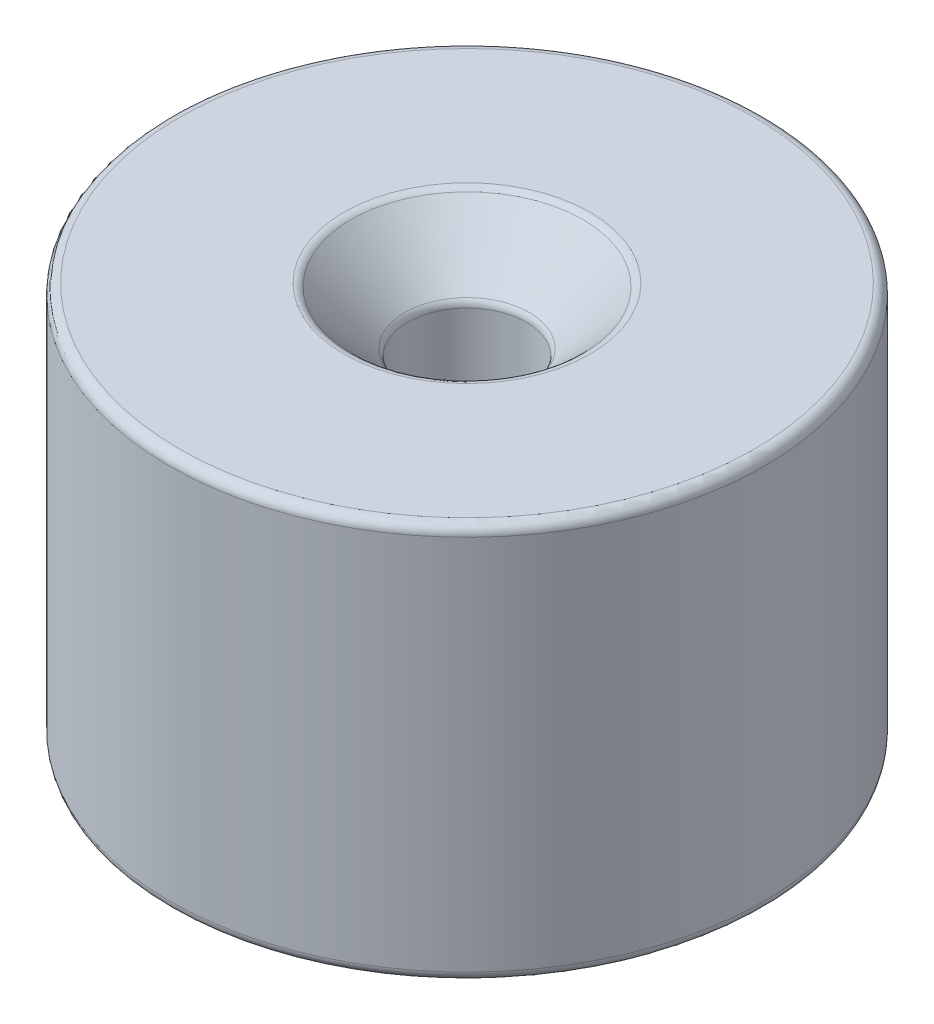
ISO-10303-21;
HEADER;
FILE_DESCRIPTION(('STEP AP214'),'2;1');
FILE_NAME('part.step','',(''),(''),'','','');
FILE_SCHEMA(('AUTOMOTIVE_DESIGN { 1 0 10303 214 1 1 1 1 }'));
ENDSEC;
DATA;
#1=APPLICATION_CONTEXT('core data for automotive mechanical design processes');
#2=APPLICATION_PROTOCOL_DEFINITION('international standard','automotive_design',2000,#1);
#3=PRODUCT_CONTEXT('',#1,'mechanical');
#4=PRODUCT('Part','Part','',(#3));
#5=PRODUCT_RELATED_PRODUCT_CATEGORY('part','',(#4));
#6=PRODUCT_DEFINITION_FORMATION('','',#4);
#7=PRODUCT_DEFINITION_CONTEXT('part definition',#1,'design');
#8=PRODUCT_DEFINITION('design','',#6,#7);
#9=PRODUCT_DEFINITION_SHAPE('','',#8);
#10=(LENGTH_UNIT() NAMED_UNIT(*) SI_UNIT(.MILLI.,.METRE.));
#11=(NAMED_UNIT(*) PLANE_ANGLE_UNIT() SI_UNIT($,.RADIAN.));
#12=(NAMED_UNIT(*) SI_UNIT($,.STERADIAN.) SOLID_ANGLE_UNIT());
#13=UNCERTAINTY_MEASURE_WITH_UNIT(LENGTH_MEASURE(1.E-05),#10,'distance_accuracy_value','');
#14=(GEOMETRIC_REPRESENTATION_CONTEXT(3) GLOBAL_UNCERTAINTY_ASSIGNED_CONTEXT((#13)) GLOBAL_UNIT_ASSIGNED_CONTEXT((#10,
#11,#12)) REPRESENTATION_CONTEXT('',''));
#15=CARTESIAN_POINT('',(0.,0.,0.));
#16=DIRECTION('',(0.,0.,1.));
#17=DIRECTION('',(1.,0.,0.));
#18=AXIS2_PLACEMENT_3D('',#15,#16,#17);
#19=CARTESIAN_POINT('',(0.,20.,0.));
#20=DIRECTION('',(0.,1.,0.));
#21=DIRECTION('',(0.,0.,1.));
#22=AXIS2_PLACEMENT_3D('',#19,#20,#21);
#23=PLANE('',#22);
#24=CARTESIAN_POINT('',(0.,20.,0.));
#25=DIRECTION('',(0.,1.,0.));
#26=DIRECTION('',(0.,0.,1.));
#27=AXIS2_PLACEMENT_3D('',#24,#25,#26);
#28=CIRCLE('',#27,14.5);
#29=CARTESIAN_POINT('',(0.,20.,14.5));
#30=VERTEX_POINT('',#29);
#31=EDGE_CURVE('E10',#30,#30,#28,.T.);
#32=ORIENTED_EDGE('',*,*,#31,.T.);
#33=EDGE_LOOP('',(#32));
#34=FACE_BOUND('',#33,.T.);
#35=CARTESIAN_POINT('',(0.,20.,0.));
#36=DIRECTION('',(0.,1.,0.));
#37=DIRECTION('',(0.,0.,1.));
#38=AXIS2_PLACEMENT_3D('',#35,#36,#37);
#39=CIRCLE('',#38,6.20710678118655);
#40=CARTESIAN_POINT('',(0.,20.,6.20710678118655));
#41=VERTEX_POINT('',#40);
#42=EDGE_CURVE('E39',#41,#41,#39,.F.);
#43=ORIENTED_EDGE('',*,*,#42,.T.);
#44=EDGE_LOOP('',(#43));
#45=FACE_BOUND('',#44,.T.);
#46=ADVANCED_FACE('F32',(#34,#45),#23,.T.);
#47=CARTESIAN_POINT('',(0.,0.,0.));
#48=DIRECTION('',(0.,1.,0.));
#49=DIRECTION('',(0.,0.,1.));
#50=AXIS2_PLACEMENT_3D('',#47,#48,#49);
#51=PLANE('',#50);
#52=CARTESIAN_POINT('',(0.,0.,0.));
#53=DIRECTION('',(0.,1.,0.));
#54=DIRECTION('',(0.,0.,1.));
#55=AXIS2_PLACEMENT_3D('',#52,#53,#54);
#56=CIRCLE('',#55,14.5);
#57=CARTESIAN_POINT('',(0.,0.,14.5));
#58=VERTEX_POINT('',#57);
#59=EDGE_CURVE('E58',#58,#58,#56,.F.);
#60=ORIENTED_EDGE('',*,*,#59,.T.);
#61=EDGE_LOOP('',(#60));
#62=FACE_BOUND('',#61,.T.);
#63=CARTESIAN_POINT('',(0.,0.,0.));
#64=DIRECTION('',(0.,1.,0.));
#65=DIRECTION('',(0.,0.,1.));
#66=AXIS2_PLACEMENT_3D('',#63,#64,#65);
#67=CIRCLE('',#66,3.5);
#68=CARTESIAN_POINT('',(0.,0.,3.5));
#69=VERTEX_POINT('',#68);
#70=EDGE_CURVE('E61',#69,#69,#67,.T.);
#71=ORIENTED_EDGE('',*,*,#70,.T.);
#72=EDGE_LOOP('',(#71));
#73=FACE_BOUND('',#72,.T.);
#74=ADVANCED_FACE('F86',(#62,#73),#51,.F.);
#75=CARTESIAN_POINT('',(0.,20.,0.));
#76=DIRECTION('',(0.,-1.,0.));
#77=DIRECTION('',(0.,0.,-1.));
#78=AXIS2_PLACEMENT_3D('',#75,#76,#77);
#79=CYLINDRICAL_SURFACE('',#78,15.);
#80=CARTESIAN_POINT('',(0.,0.5,0.));
#81=DIRECTION('',(0.,1.,0.));
#82=DIRECTION('',(0.,0.,1.));
#83=AXIS2_PLACEMENT_3D('',#80,#81,#82);
#84=CIRCLE('',#83,15.);
#85=CARTESIAN_POINT('',(0.,0.5,15.));
#86=VERTEX_POINT('',#85);
#87=EDGE_CURVE('E64',#86,#86,#84,.T.);
#88=ORIENTED_EDGE('',*,*,#87,.T.);
#89=EDGE_LOOP('',(#88));
#90=FACE_BOUND('',#89,.T.);
#91=CARTESIAN_POINT('',(0.,19.5,0.));
#92=DIRECTION('',(0.,1.,0.));
#93=DIRECTION('',(0.,0.,1.));
#94=AXIS2_PLACEMENT_3D('',#91,#92,#93);
#95=CIRCLE('',#94,15.);
#96=CARTESIAN_POINT('',(0.,19.5,15.));
#97=VERTEX_POINT('',#96);
#98=EDGE_CURVE('E67',#97,#97,#95,.F.);
#99=ORIENTED_EDGE('',*,*,#98,.T.);
#100=EDGE_LOOP('',(#99));
#101=FACE_BOUND('',#100,.T.);
#102=ADVANCED_FACE('F71',(#90,#101),#79,.T.);
#103=CARTESIAN_POINT('',(0.,20.,0.));
#104=DIRECTION('',(0.,-1.,0.));
#105=DIRECTION('',(0.,0.,-1.));
#106=AXIS2_PLACEMENT_3D('',#103,#104,#105);
#107=CYLINDRICAL_SURFACE('',#106,3.);
#108=CARTESIAN_POINT('',(0.,0.5,0.));
#109=DIRECTION('',(0.,1.,0.));
#110=DIRECTION('',(0.,0.,1.));
#111=AXIS2_PLACEMENT_3D('',#108,#109,#110);
#112=CIRCLE('',#111,3.);
#113=CARTESIAN_POINT('',(0.,0.5,3.));
#114=VERTEX_POINT('',#113);
#115=EDGE_CURVE('E52',#114,#114,#112,.F.);
#116=ORIENTED_EDGE('',*,*,#115,.T.);
#117=EDGE_LOOP('',(#116));
#118=FACE_BOUND('',#117,.T.);
#119=CARTESIAN_POINT('',(0.,16.7928932188135,0.));
#120=DIRECTION('',(0.,-1.,0.));
#121=DIRECTION('',(0.,0.,-1.));
#122=AXIS2_PLACEMENT_3D('',#119,#120,#121);
#123=CIRCLE('',#122,3.);
#124=CARTESIAN_POINT('',(0.,16.7928932188135,-3.));
#125=VERTEX_POINT('',#124);
#126=EDGE_CURVE('E55',#125,#125,#123,.F.);
#127=ORIENTED_EDGE('',*,*,#126,.T.);
#128=EDGE_LOOP('',(#127));
#129=FACE_BOUND('',#128,.T.);
#130=ADVANCED_FACE('F94',(#118,#129),#107,.F.);
#131=CARTESIAN_POINT('',(0.,17.,0.));
#132=DIRECTION('',(0.,1.,0.));
#133=DIRECTION('',(0.,0.,1.));
#134=AXIS2_PLACEMENT_3D('',#131,#132,#133);
#135=CONICAL_SURFACE('',#134,3.,0.78539816339745);
#136=CARTESIAN_POINT('',(0.,17.1464466094067,0.));
#137=DIRECTION('',(0.,-1.,0.));
#138=DIRECTION('',(0.,0.,-1.));
#139=AXIS2_PLACEMENT_3D('',#136,#137,#138);
#140=CIRCLE('',#139,3.14644660940673);
#141=CARTESIAN_POINT('',(0.,17.1464466094067,-3.14644660940673));
#142=VERTEX_POINT('',#141);
#143=EDGE_CURVE('E43',#142,#142,#140,.T.);
#144=ORIENTED_EDGE('',*,*,#143,.T.);
#145=EDGE_LOOP('',(#144));
#146=FACE_BOUND('',#145,.T.);
#147=CARTESIAN_POINT('',(0.,19.8535533905933,0.));
#148=DIRECTION('',(0.,-1.,0.));
#149=DIRECTION('',(0.,0.,-1.));
#150=AXIS2_PLACEMENT_3D('',#147,#148,#149);
#151=CIRCLE('',#150,5.85355339059328);
#152=CARTESIAN_POINT('',(0.,19.8535533905933,-5.85355339059328));
#153=VERTEX_POINT('',#152);
#154=EDGE_CURVE('E47',#153,#153,#151,.F.);
#155=ORIENTED_EDGE('',*,*,#154,.T.);
#156=EDGE_LOOP('',(#155));
#157=FACE_BOUND('',#156,.T.);
#158=ADVANCED_FACE('F99',(#146,#157),#135,.F.);
#159=CARTESIAN_POINT('',(0.,0.5,0.));
#160=DIRECTION('',(0.,1.,0.));
#161=DIRECTION('',(0.,0.,1.));
#162=AXIS2_PLACEMENT_3D('',#159,#160,#161);
#163=TOROIDAL_SURFACE('',#162,14.5,0.5);
#164=ORIENTED_EDGE('',*,*,#59,.F.);
#165=EDGE_LOOP('',(#164));
#166=FACE_BOUND('',#165,.T.);
#167=ORIENTED_EDGE('',*,*,#87,.F.);
#168=EDGE_LOOP('',(#167));
#169=FACE_BOUND('',#168,.T.);
#170=ADVANCED_FACE('F102',(#166,#169),#163,.T.);
#171=CARTESIAN_POINT('',(0.,0.5,0.));
#172=DIRECTION('',(0.,1.,0.));
#173=DIRECTION('',(0.,0.,1.));
#174=AXIS2_PLACEMENT_3D('',#171,#172,#173);
#175=TOROIDAL_SURFACE('',#174,3.5,0.5);
#176=ORIENTED_EDGE('',*,*,#115,.F.);
#177=EDGE_LOOP('',(#176));
#178=FACE_BOUND('',#177,.T.);
#179=ORIENTED_EDGE('',*,*,#70,.F.);
#180=EDGE_LOOP('',(#179));
#181=FACE_BOUND('',#180,.T.);
#182=ADVANCED_FACE('F82',(#178,#181),#175,.T.);
#183=CARTESIAN_POINT('',(0.,16.7928932188135,0.));
#184=DIRECTION('',(0.,-1.,0.));
#185=DIRECTION('',(0.,0.,-1.));
#186=AXIS2_PLACEMENT_3D('',#183,#184,#185);
#187=TOROIDAL_SURFACE('',#186,3.5,0.5);
#188=ORIENTED_EDGE('',*,*,#143,.F.);
#189=EDGE_LOOP('',(#188));
#190=FACE_BOUND('',#189,.T.);
#191=ORIENTED_EDGE('',*,*,#126,.F.);
#192=EDGE_LOOP('',(#191));
#193=FACE_BOUND('',#192,.T.);
#194=ADVANCED_FACE('F76',(#190,#193),#187,.T.);
#195=CARTESIAN_POINT('',(0.,19.5,0.));
#196=DIRECTION('',(0.,1.,0.));
#197=DIRECTION('',(0.,0.,1.));
#198=AXIS2_PLACEMENT_3D('',#195,#196,#197);
#199=TOROIDAL_SURFACE('',#198,14.5,0.5);
#200=ORIENTED_EDGE('',*,*,#98,.F.);
#201=EDGE_LOOP('',(#200));
#202=FACE_BOUND('',#201,.T.);
#203=ORIENTED_EDGE('',*,*,#31,.F.);
#204=EDGE_LOOP('',(#203));
#205=FACE_BOUND('',#204,.T.);
#206=ADVANCED_FACE('F73',(#202,#205),#199,.T.);
#207=CARTESIAN_POINT('',(0.,19.5,0.));
#208=DIRECTION('',(0.,1.,0.));
#209=DIRECTION('',(0.,0.,1.));
#210=AXIS2_PLACEMENT_3D('',#207,#208,#209);
#211=TOROIDAL_SURFACE('',#210,6.20710678118655,0.5);
#212=ORIENTED_EDGE('',*,*,#154,.F.);
#213=EDGE_LOOP('',(#212));
#214=FACE_BOUND('',#213,.T.);
#215=ORIENTED_EDGE('',*,*,#42,.F.);
#216=EDGE_LOOP('',(#215));
#217=FACE_BOUND('',#216,.T.);
#218=ADVANCED_FACE('F34',(#214,#217),#211,.T.);
#219=CLOSED_SHELL('',(#46,#74,#102,#130,#158,#170,#182,#194,#206,#218));
#220=MANIFOLD_SOLID_BREP('B2',#219);
#221=ADVANCED_BREP_SHAPE_REPRESENTATION('',(#18,#220),#14);
#222=SHAPE_DEFINITION_REPRESENTATION(#9,#221);
ENDSEC;
END-ISO-10303-21;
